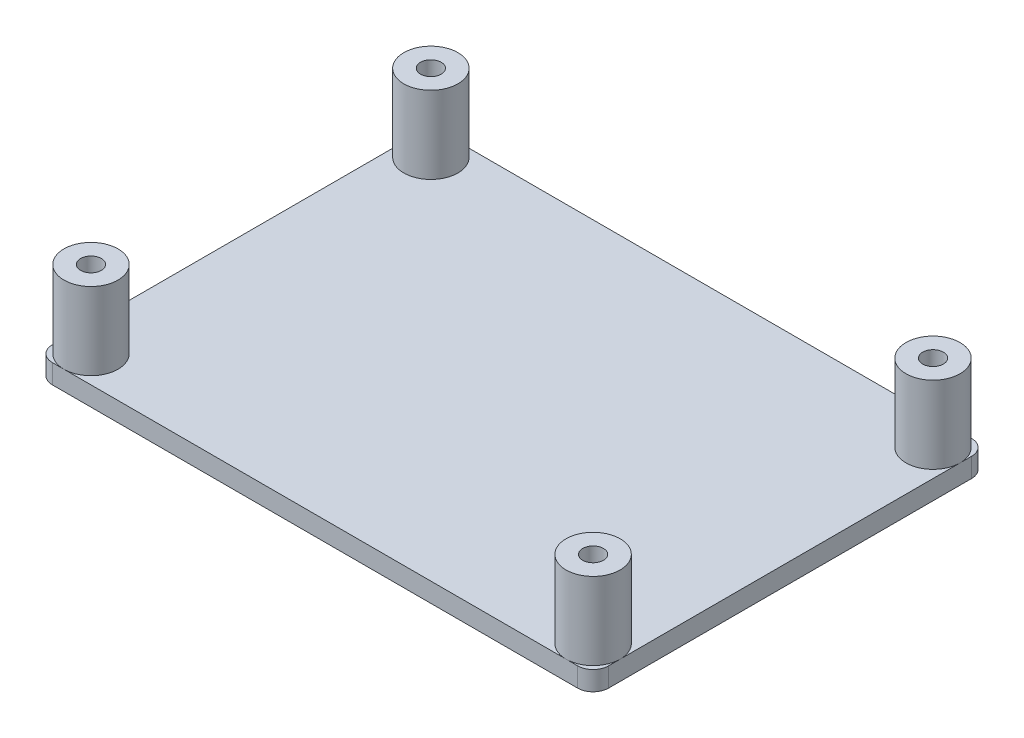
ISO-10303-21;
HEADER;
FILE_DESCRIPTION(('STEP AP214'),'2;1');
FILE_NAME('part.step','',(''),(''),'','','');
FILE_SCHEMA(('AUTOMOTIVE_DESIGN { 1 0 10303 214 1 1 1 1 }'));
ENDSEC;
DATA;
#1=APPLICATION_CONTEXT('core data for automotive mechanical design processes');
#2=APPLICATION_PROTOCOL_DEFINITION('international standard','automotive_design',2000,#1);
#3=PRODUCT_CONTEXT('',#1,'mechanical');
#4=PRODUCT('Part','Part','',(#3));
#5=PRODUCT_RELATED_PRODUCT_CATEGORY('part','',(#4));
#6=PRODUCT_DEFINITION_FORMATION('','',#4);
#7=PRODUCT_DEFINITION_CONTEXT('part definition',#1,'design');
#8=PRODUCT_DEFINITION('design','',#6,#7);
#9=PRODUCT_DEFINITION_SHAPE('','',#8);
#10=(LENGTH_UNIT() NAMED_UNIT(*) SI_UNIT(.MILLI.,.METRE.));
#11=(NAMED_UNIT(*) PLANE_ANGLE_UNIT() SI_UNIT($,.RADIAN.));
#12=(NAMED_UNIT(*) SI_UNIT($,.STERADIAN.) SOLID_ANGLE_UNIT());
#13=UNCERTAINTY_MEASURE_WITH_UNIT(LENGTH_MEASURE(1.E-05),#10,'distance_accuracy_value','');
#14=(GEOMETRIC_REPRESENTATION_CONTEXT(3) GLOBAL_UNCERTAINTY_ASSIGNED_CONTEXT((#13)) GLOBAL_UNIT_ASSIGNED_CONTEXT((#10,
#11,#12)) REPRESENTATION_CONTEXT('',''));
#15=CARTESIAN_POINT('',(0.,0.,0.));
#16=DIRECTION('',(0.,0.,1.));
#17=DIRECTION('',(1.,0.,0.));
#18=AXIS2_PLACEMENT_3D('',#15,#16,#17);
#19=CARTESIAN_POINT('',(0.,3.175,0.));
#20=DIRECTION('',(0.,-1.,0.));
#21=DIRECTION('',(0.,0.,-1.));
#22=AXIS2_PLACEMENT_3D('',#19,#20,#21);
#23=PLANE('',#22);
#24=DIRECTION('',(0.,0.,1.));
#25=VECTOR('',#24,1.);
#26=CARTESIAN_POINT('',(-45.72,3.175,32.385));
#27=LINE('',#26,#25);
#28=CARTESIAN_POINT('',(-45.72,3.175,27.94));
#29=VERTEX_POINT('',#28);
#30=CARTESIAN_POINT('',(-45.72,3.175,29.845));
#31=VERTEX_POINT('',#30);
#32=EDGE_CURVE('E145',#29,#31,#27,.T.);
#33=ORIENTED_EDGE('',*,*,#32,.T.);
#34=CARTESIAN_POINT('',(-43.18,3.175,29.845));
#35=DIRECTION('',(0.,-1.,0.));
#36=DIRECTION('',(0.,0.,-1.));
#37=AXIS2_PLACEMENT_3D('',#34,#35,#36);
#38=CIRCLE('',#37,2.54);
#39=CARTESIAN_POINT('',(-43.18,3.175,32.385));
#40=VERTEX_POINT('',#39);
#41=EDGE_CURVE('E11',#31,#40,#38,.F.);
#42=ORIENTED_EDGE('',*,*,#41,.T.);
#43=DIRECTION('',(1.,0.,0.));
#44=VECTOR('',#43,1.);
#45=CARTESIAN_POINT('',(-45.72,3.175,32.385));
#46=LINE('',#45,#44);
#47=CARTESIAN_POINT('',(-41.275,3.175,32.385));
#48=VERTEX_POINT('',#47);
#49=EDGE_CURVE('E156',#40,#48,#46,.T.);
#50=ORIENTED_EDGE('',*,*,#49,.T.);
#51=CARTESIAN_POINT('',(-41.275,3.175,27.94));
#52=DIRECTION('',(0.,1.,0.));
#53=DIRECTION('',(0.,0.,1.));
#54=AXIS2_PLACEMENT_3D('',#51,#52,#53);
#55=CIRCLE('',#54,4.44499999999998);
#56=EDGE_CURVE('E154',#29,#48,#55,.T.);
#57=ORIENTED_EDGE('',*,*,#56,.F.);
#58=EDGE_LOOP('',(#33,#42,#50,#57));
#59=FACE_BOUND('',#58,.T.);
#60=ADVANCED_FACE('F43',(#59),#23,.F.);
#61=CARTESIAN_POINT('',(41.275,3.175,32.385));
#62=VERTEX_POINT('',#61);
#63=CARTESIAN_POINT('',(43.18,3.175,32.385));
#64=VERTEX_POINT('',#63);
#65=EDGE_CURVE('E206',#62,#64,#46,.T.);
#66=ORIENTED_EDGE('',*,*,#65,.T.);
#67=CARTESIAN_POINT('',(43.18,3.175,29.845));
#68=DIRECTION('',(0.,-1.,0.));
#69=DIRECTION('',(0.,0.,-1.));
#70=AXIS2_PLACEMENT_3D('',#67,#68,#69);
#71=CIRCLE('',#70,2.54);
#72=CARTESIAN_POINT('',(45.72,3.175,29.845));
#73=VERTEX_POINT('',#72);
#74=EDGE_CURVE('E264',#64,#73,#71,.F.);
#75=ORIENTED_EDGE('',*,*,#74,.T.);
#76=DIRECTION('',(0.,0.,-1.));
#77=VECTOR('',#76,1.);
#78=CARTESIAN_POINT('',(45.72,3.175,32.385));
#79=LINE('',#78,#77);
#80=CARTESIAN_POINT('',(45.72,3.175,27.94));
#81=VERTEX_POINT('',#80);
#82=EDGE_CURVE('E196',#73,#81,#79,.T.);
#83=ORIENTED_EDGE('',*,*,#82,.T.);
#84=CARTESIAN_POINT('',(41.275,3.175,27.94));
#85=DIRECTION('',(0.,1.,0.));
#86=DIRECTION('',(0.,0.,1.));
#87=AXIS2_PLACEMENT_3D('',#84,#85,#86);
#88=CIRCLE('',#87,4.44499999999999);
#89=EDGE_CURVE('E176',#62,#81,#88,.T.);
#90=ORIENTED_EDGE('',*,*,#89,.F.);
#91=EDGE_LOOP('',(#66,#75,#83,#90));
#92=FACE_BOUND('',#91,.T.);
#93=ADVANCED_FACE('F329',(#92),#23,.F.);
#94=EDGE_CURVE('E138',#48,#29,#55,.T.);
#95=ORIENTED_EDGE('',*,*,#94,.F.);
#96=EDGE_CURVE('E209',#48,#62,#46,.T.);
#97=ORIENTED_EDGE('',*,*,#96,.T.);
#98=EDGE_CURVE('E166',#81,#62,#88,.T.);
#99=ORIENTED_EDGE('',*,*,#98,.F.);
#100=CARTESIAN_POINT('',(45.72,3.175,-27.94));
#101=VERTEX_POINT('',#100);
#102=EDGE_CURVE('E200',#81,#101,#79,.T.);
#103=ORIENTED_EDGE('',*,*,#102,.T.);
#104=CARTESIAN_POINT('',(41.275,3.175,-27.94));
#105=DIRECTION('',(0.,-1.,0.));
#106=DIRECTION('',(0.,0.,-1.));
#107=AXIS2_PLACEMENT_3D('',#104,#105,#106);
#108=CIRCLE('',#107,4.44499999999998);
#109=CARTESIAN_POINT('',(41.275,3.175,-32.385));
#110=VERTEX_POINT('',#109);
#111=EDGE_CURVE('E224',#110,#101,#108,.F.);
#112=ORIENTED_EDGE('',*,*,#111,.F.);
#113=DIRECTION('',(-1.,0.,0.));
#114=VECTOR('',#113,1.);
#115=CARTESIAN_POINT('',(-45.72,3.175,-32.385));
#116=LINE('',#115,#114);
#117=CARTESIAN_POINT('',(-41.275,3.175,-32.385));
#118=VERTEX_POINT('',#117);
#119=EDGE_CURVE('E203',#110,#118,#116,.T.);
#120=ORIENTED_EDGE('',*,*,#119,.T.);
#121=CARTESIAN_POINT('',(-41.275,3.175,-27.94));
#122=DIRECTION('',(0.,1.,0.));
#123=DIRECTION('',(0.,0.,1.));
#124=AXIS2_PLACEMENT_3D('',#121,#122,#123);
#125=CIRCLE('',#124,4.44499999999998);
#126=CARTESIAN_POINT('',(-45.72,3.175,-27.94));
#127=VERTEX_POINT('',#126);
#128=EDGE_CURVE('E141',#127,#118,#125,.T.);
#129=ORIENTED_EDGE('',*,*,#128,.F.);
#130=EDGE_CURVE('E135',#127,#29,#27,.T.);
#131=ORIENTED_EDGE('',*,*,#130,.T.);
#132=EDGE_LOOP('',(#95,#97,#99,#103,#112,#120,#129,#131));
#133=FACE_BOUND('',#132,.T.);
#134=ADVANCED_FACE('F136',(#133),#23,.F.);
#135=CARTESIAN_POINT('',(-43.18,3.175,-32.385));
#136=VERTEX_POINT('',#135);
#137=EDGE_CURVE('E199',#118,#136,#116,.T.);
#138=ORIENTED_EDGE('',*,*,#137,.T.);
#139=CARTESIAN_POINT('',(-43.18,3.175,-29.845));
#140=DIRECTION('',(0.,-1.,0.));
#141=DIRECTION('',(0.,0.,-1.));
#142=AXIS2_PLACEMENT_3D('',#139,#140,#141);
#143=CIRCLE('',#142,2.54);
#144=CARTESIAN_POINT('',(-45.72,3.175,-29.845));
#145=VERTEX_POINT('',#144);
#146=EDGE_CURVE('E52',#136,#145,#143,.F.);
#147=ORIENTED_EDGE('',*,*,#146,.T.);
#148=EDGE_CURVE('E144',#145,#127,#27,.T.);
#149=ORIENTED_EDGE('',*,*,#148,.T.);
#150=EDGE_CURVE('E185',#118,#127,#125,.T.);
#151=ORIENTED_EDGE('',*,*,#150,.F.);
#152=EDGE_LOOP('',(#138,#147,#149,#151));
#153=FACE_BOUND('',#152,.T.);
#154=ADVANCED_FACE('F309',(#153),#23,.F.);
#155=CARTESIAN_POINT('',(45.72,3.175,32.385));
#156=DIRECTION('',(-1.,0.,0.));
#157=DIRECTION('',(0.,0.,1.));
#158=AXIS2_PLACEMENT_3D('',#155,#156,#157);
#159=PLANE('',#158);
#160=DIRECTION('',(0.,0.,-1.));
#161=VECTOR('',#160,1.);
#162=CARTESIAN_POINT('',(45.72,0.,32.385));
#163=LINE('',#162,#161);
#164=CARTESIAN_POINT('',(45.72,0.,29.845));
#165=VERTEX_POINT('',#164);
#166=CARTESIAN_POINT('',(45.72,0.,-29.845));
#167=VERTEX_POINT('',#166);
#168=EDGE_CURVE('E193',#165,#167,#163,.T.);
#169=ORIENTED_EDGE('',*,*,#168,.T.);
#170=DIRECTION('',(0.,-1.,0.));
#171=VECTOR('',#170,1.);
#172=CARTESIAN_POINT('',(45.72,3.175,-29.845));
#173=LINE('',#172,#171);
#174=CARTESIAN_POINT('',(45.72,3.175,-29.845));
#175=VERTEX_POINT('',#174);
#176=EDGE_CURVE('E251',#167,#175,#173,.F.);
#177=ORIENTED_EDGE('',*,*,#176,.T.);
#178=EDGE_CURVE('E201',#101,#175,#79,.T.);
#179=ORIENTED_EDGE('',*,*,#178,.F.);
#180=ORIENTED_EDGE('',*,*,#102,.F.);
#181=ORIENTED_EDGE('',*,*,#82,.F.);
#182=DIRECTION('',(0.,-1.,0.));
#183=VECTOR('',#182,1.);
#184=CARTESIAN_POINT('',(45.72,3.175,29.845));
#185=LINE('',#184,#183);
#186=EDGE_CURVE('E247',#73,#165,#185,.T.);
#187=ORIENTED_EDGE('',*,*,#186,.T.);
#188=EDGE_LOOP('',(#169,#177,#179,#180,#181,#187));
#189=FACE_BOUND('',#188,.T.);
#190=ADVANCED_FACE('F295',(#189),#159,.F.);
#191=CARTESIAN_POINT('',(-45.72,3.175,-32.385));
#192=DIRECTION('',(0.,0.,1.));
#193=DIRECTION('',(1.,0.,0.));
#194=AXIS2_PLACEMENT_3D('',#191,#192,#193);
#195=PLANE('',#194);
#196=CARTESIAN_POINT('',(43.18,3.175,-32.385));
#197=VERTEX_POINT('',#196);
#198=EDGE_CURVE('E152',#197,#110,#116,.T.);
#199=ORIENTED_EDGE('',*,*,#198,.F.);
#200=DIRECTION('',(0.,-1.,0.));
#201=VECTOR('',#200,1.);
#202=CARTESIAN_POINT('',(43.18,3.175,-32.385));
#203=LINE('',#202,#201);
#204=CARTESIAN_POINT('',(43.18,0.,-32.385));
#205=VERTEX_POINT('',#204);
#206=EDGE_CURVE('E231',#197,#205,#203,.T.);
#207=ORIENTED_EDGE('',*,*,#206,.T.);
#208=DIRECTION('',(-1.,0.,0.));
#209=VECTOR('',#208,1.);
#210=CARTESIAN_POINT('',(-45.72,0.,-32.385));
#211=LINE('',#210,#209);
#212=CARTESIAN_POINT('',(-43.18,0.,-32.385));
#213=VERTEX_POINT('',#212);
#214=EDGE_CURVE('E213',#205,#213,#211,.T.);
#215=ORIENTED_EDGE('',*,*,#214,.T.);
#216=DIRECTION('',(0.,-1.,0.));
#217=VECTOR('',#216,1.);
#218=CARTESIAN_POINT('',(-43.18,3.175,-32.385));
#219=LINE('',#218,#217);
#220=EDGE_CURVE('E228',#213,#136,#219,.F.);
#221=ORIENTED_EDGE('',*,*,#220,.T.);
#222=ORIENTED_EDGE('',*,*,#137,.F.);
#223=ORIENTED_EDGE('',*,*,#119,.F.);
#224=EDGE_LOOP('',(#199,#207,#215,#221,#222,#223));
#225=FACE_BOUND('',#224,.T.);
#226=ADVANCED_FACE('F307',(#225),#195,.F.);
#227=CARTESIAN_POINT('',(-45.72,3.175,32.385));
#228=DIRECTION('',(1.,0.,0.));
#229=DIRECTION('',(0.,0.,-1.));
#230=AXIS2_PLACEMENT_3D('',#227,#228,#229);
#231=PLANE('',#230);
#232=ORIENTED_EDGE('',*,*,#148,.F.);
#233=DIRECTION('',(0.,-1.,0.));
#234=VECTOR('',#233,1.);
#235=CARTESIAN_POINT('',(-45.72,3.175,-29.845));
#236=LINE('',#235,#234);
#237=CARTESIAN_POINT('',(-45.72,0.,-29.845));
#238=VERTEX_POINT('',#237);
#239=EDGE_CURVE('E269',#145,#238,#236,.T.);
#240=ORIENTED_EDGE('',*,*,#239,.T.);
#241=DIRECTION('',(0.,0.,1.));
#242=VECTOR('',#241,1.);
#243=CARTESIAN_POINT('',(-45.72,0.,32.385));
#244=LINE('',#243,#242);
#245=CARTESIAN_POINT('',(-45.72,0.,29.845));
#246=VERTEX_POINT('',#245);
#247=EDGE_CURVE('E217',#238,#246,#244,.T.);
#248=ORIENTED_EDGE('',*,*,#247,.T.);
#249=DIRECTION('',(0.,-1.,0.));
#250=VECTOR('',#249,1.);
#251=CARTESIAN_POINT('',(-45.72,3.175,29.845));
#252=LINE('',#251,#250);
#253=EDGE_CURVE('E66',#246,#31,#252,.F.);
#254=ORIENTED_EDGE('',*,*,#253,.T.);
#255=ORIENTED_EDGE('',*,*,#32,.F.);
#256=ORIENTED_EDGE('',*,*,#130,.F.);
#257=EDGE_LOOP('',(#232,#240,#248,#254,#255,#256));
#258=FACE_BOUND('',#257,.T.);
#259=ADVANCED_FACE('F148',(#258),#231,.F.);
#260=CARTESIAN_POINT('',(-45.72,3.175,32.385));
#261=DIRECTION('',(0.,0.,-1.));
#262=DIRECTION('',(-1.,0.,0.));
#263=AXIS2_PLACEMENT_3D('',#260,#261,#262);
#264=PLANE('',#263);
#265=DIRECTION('',(1.,0.,0.));
#266=VECTOR('',#265,1.);
#267=CARTESIAN_POINT('',(-45.72,0.,32.385));
#268=LINE('',#267,#266);
#269=CARTESIAN_POINT('',(-43.18,0.,32.385));
#270=VERTEX_POINT('',#269);
#271=CARTESIAN_POINT('',(43.18,0.,32.385));
#272=VERTEX_POINT('',#271);
#273=EDGE_CURVE('E220',#270,#272,#268,.T.);
#274=ORIENTED_EDGE('',*,*,#273,.T.);
#275=DIRECTION('',(0.,-1.,0.));
#276=VECTOR('',#275,1.);
#277=CARTESIAN_POINT('',(43.18,3.175,32.385));
#278=LINE('',#277,#276);
#279=EDGE_CURVE('E261',#272,#64,#278,.F.);
#280=ORIENTED_EDGE('',*,*,#279,.T.);
#281=ORIENTED_EDGE('',*,*,#65,.F.);
#282=ORIENTED_EDGE('',*,*,#96,.F.);
#283=ORIENTED_EDGE('',*,*,#49,.F.);
#284=DIRECTION('',(0.,-1.,0.));
#285=VECTOR('',#284,1.);
#286=CARTESIAN_POINT('',(-43.18,3.175,32.385));
#287=LINE('',#286,#285);
#288=EDGE_CURVE('E257',#40,#270,#287,.T.);
#289=ORIENTED_EDGE('',*,*,#288,.T.);
#290=EDGE_LOOP('',(#274,#280,#281,#282,#283,#289));
#291=FACE_BOUND('',#290,.T.);
#292=ADVANCED_FACE('F335',(#291),#264,.F.);
#293=ORIENTED_EDGE('',*,*,#178,.T.);
#294=CARTESIAN_POINT('',(43.18,3.175,-29.845));
#295=DIRECTION('',(0.,-1.,0.));
#296=DIRECTION('',(0.,0.,-1.));
#297=AXIS2_PLACEMENT_3D('',#294,#295,#296);
#298=CIRCLE('',#297,2.54);
#299=EDGE_CURVE('E254',#175,#197,#298,.F.);
#300=ORIENTED_EDGE('',*,*,#299,.T.);
#301=ORIENTED_EDGE('',*,*,#198,.T.);
#302=CARTESIAN_POINT('',(41.275,3.175,-27.94));
#303=DIRECTION('',(0.,1.,0.));
#304=DIRECTION('',(0.,0.,1.));
#305=AXIS2_PLACEMENT_3D('',#302,#303,#304);
#306=CIRCLE('',#305,4.44499999999998);
#307=EDGE_CURVE('E181',#101,#110,#306,.T.);
#308=ORIENTED_EDGE('',*,*,#307,.F.);
#309=EDGE_LOOP('',(#293,#300,#301,#308));
#310=FACE_BOUND('',#309,.T.);
#311=ADVANCED_FACE('F323',(#310),#23,.F.);
#312=CARTESIAN_POINT('',(0.,0.,0.));
#313=DIRECTION('',(0.,-1.,0.));
#314=DIRECTION('',(0.,0.,-1.));
#315=AXIS2_PLACEMENT_3D('',#312,#313,#314);
#316=PLANE('',#315);
#317=CARTESIAN_POINT('',(-41.275,0.,27.94));
#318=DIRECTION('',(0.,1.,0.));
#319=DIRECTION('',(0.,0.,1.));
#320=AXIS2_PLACEMENT_3D('',#317,#318,#319);
#321=CIRCLE('',#320,1.6999966);
#322=CARTESIAN_POINT('',(-41.275,0.,29.6399966));
#323=VERTEX_POINT('',#322);
#324=EDGE_CURVE('E622',#323,#323,#321,.T.);
#325=ORIENTED_EDGE('',*,*,#324,.T.);
#326=EDGE_LOOP('',(#325));
#327=FACE_BOUND('',#326,.T.);
#328=CARTESIAN_POINT('',(41.275,0.,27.94));
#329=DIRECTION('',(0.,1.,0.));
#330=DIRECTION('',(0.,0.,1.));
#331=AXIS2_PLACEMENT_3D('',#328,#329,#330);
#332=CIRCLE('',#331,1.6999966);
#333=CARTESIAN_POINT('',(41.275,0.,29.6399966));
#334=VERTEX_POINT('',#333);
#335=EDGE_CURVE('E614',#334,#334,#332,.T.);
#336=ORIENTED_EDGE('',*,*,#335,.T.);
#337=EDGE_LOOP('',(#336));
#338=FACE_BOUND('',#337,.T.);
#339=CARTESIAN_POINT('',(41.275,0.,-27.94));
#340=DIRECTION('',(0.,1.,0.));
#341=DIRECTION('',(0.,0.,1.));
#342=AXIS2_PLACEMENT_3D('',#339,#340,#341);
#343=CIRCLE('',#342,1.6999966);
#344=CARTESIAN_POINT('',(41.275,0.,-26.2400034));
#345=VERTEX_POINT('',#344);
#346=EDGE_CURVE('E602',#345,#345,#343,.T.);
#347=ORIENTED_EDGE('',*,*,#346,.T.);
#348=EDGE_LOOP('',(#347));
#349=FACE_BOUND('',#348,.T.);
#350=CARTESIAN_POINT('',(-41.275,0.,-27.94));
#351=DIRECTION('',(0.,1.,0.));
#352=DIRECTION('',(0.,0.,1.));
#353=AXIS2_PLACEMENT_3D('',#350,#351,#352);
#354=CIRCLE('',#353,1.6999966);
#355=CARTESIAN_POINT('',(-41.275,0.,-26.2400034));
#356=VERTEX_POINT('',#355);
#357=EDGE_CURVE('E175',#356,#356,#354,.T.);
#358=ORIENTED_EDGE('',*,*,#357,.T.);
#359=EDGE_LOOP('',(#358));
#360=FACE_BOUND('',#359,.T.);
#361=ORIENTED_EDGE('',*,*,#214,.F.);
#362=CARTESIAN_POINT('',(43.18,0.,-29.845));
#363=DIRECTION('',(0.,-1.,0.));
#364=DIRECTION('',(0.,0.,-1.));
#365=AXIS2_PLACEMENT_3D('',#362,#363,#364);
#366=CIRCLE('',#365,2.54);
#367=EDGE_CURVE('E244',#205,#167,#366,.T.);
#368=ORIENTED_EDGE('',*,*,#367,.T.);
#369=ORIENTED_EDGE('',*,*,#168,.F.);
#370=CARTESIAN_POINT('',(43.18,0.,29.845));
#371=DIRECTION('',(0.,-1.,0.));
#372=DIRECTION('',(0.,0.,-1.));
#373=AXIS2_PLACEMENT_3D('',#370,#371,#372);
#374=CIRCLE('',#373,2.54);
#375=EDGE_CURVE('E241',#165,#272,#374,.T.);
#376=ORIENTED_EDGE('',*,*,#375,.T.);
#377=ORIENTED_EDGE('',*,*,#273,.F.);
#378=CARTESIAN_POINT('',(-43.18,0.,29.845));
#379=DIRECTION('',(0.,-1.,0.));
#380=DIRECTION('',(0.,0.,-1.));
#381=AXIS2_PLACEMENT_3D('',#378,#379,#380);
#382=CIRCLE('',#381,2.54);
#383=EDGE_CURVE('E235',#270,#246,#382,.T.);
#384=ORIENTED_EDGE('',*,*,#383,.T.);
#385=ORIENTED_EDGE('',*,*,#247,.F.);
#386=CARTESIAN_POINT('',(-43.18,0.,-29.845));
#387=DIRECTION('',(0.,-1.,0.));
#388=DIRECTION('',(0.,0.,-1.));
#389=AXIS2_PLACEMENT_3D('',#386,#387,#388);
#390=CIRCLE('',#389,2.54);
#391=EDGE_CURVE('E238',#238,#213,#390,.T.);
#392=ORIENTED_EDGE('',*,*,#391,.T.);
#393=EDGE_LOOP('',(#361,#368,#369,#376,#377,#384,#385,#392));
#394=FACE_BOUND('',#393,.T.);
#395=ADVANCED_FACE('F314',(#327,#338,#349,#360,#394),#316,.T.);
#396=CARTESIAN_POINT('',(-41.275,15.875,-27.94));
#397=DIRECTION('',(0.,-1.,0.));
#398=DIRECTION('',(0.,0.,-1.));
#399=AXIS2_PLACEMENT_3D('',#396,#397,#398);
#400=CYLINDRICAL_SURFACE('',#399,4.44499999999998);
#401=CARTESIAN_POINT('',(-41.275,15.875,-27.94));
#402=DIRECTION('',(0.,1.,0.));
#403=DIRECTION('',(0.,0.,1.));
#404=AXIS2_PLACEMENT_3D('',#401,#402,#403);
#405=CIRCLE('',#404,4.44499999999998);
#406=CARTESIAN_POINT('',(-41.275,15.875,-23.495));
#407=VERTEX_POINT('',#406);
#408=EDGE_CURVE('E189',#407,#407,#405,.T.);
#409=ORIENTED_EDGE('',*,*,#408,.F.);
#410=EDGE_LOOP('',(#409));
#411=FACE_BOUND('',#410,.T.);
#412=ORIENTED_EDGE('',*,*,#150,.T.);
#413=ORIENTED_EDGE('',*,*,#128,.T.);
#414=EDGE_LOOP('',(#412,#413));
#415=FACE_BOUND('',#414,.T.);
#416=ADVANCED_FACE('F311',(#411,#415),#400,.T.);
#417=CARTESIAN_POINT('',(-41.275,15.875,-27.94));
#418=DIRECTION('',(0.,1.,0.));
#419=DIRECTION('',(0.,0.,1.));
#420=AXIS2_PLACEMENT_3D('',#417,#418,#419);
#421=PLANE('',#420);
#422=CARTESIAN_POINT('',(-41.275,15.875,-27.94));
#423=DIRECTION('',(0.,1.,0.));
#424=DIRECTION('',(0.,0.,1.));
#425=AXIS2_PLACEMENT_3D('',#422,#423,#424);
#426=CIRCLE('',#425,1.6999966);
#427=CARTESIAN_POINT('',(-41.275,15.875,-26.2400034));
#428=VERTEX_POINT('',#427);
#429=EDGE_CURVE('E170',#428,#428,#426,.T.);
#430=ORIENTED_EDGE('',*,*,#429,.F.);
#431=EDGE_LOOP('',(#430));
#432=FACE_BOUND('',#431,.T.);
#433=ORIENTED_EDGE('',*,*,#408,.T.);
#434=EDGE_LOOP('',(#433));
#435=FACE_BOUND('',#434,.T.);
#436=ADVANCED_FACE('F313',(#432,#435),#421,.T.);
#437=CARTESIAN_POINT('',(41.275,15.875,-27.94));
#438=DIRECTION('',(0.,-1.,0.));
#439=DIRECTION('',(0.,0.,-1.));
#440=AXIS2_PLACEMENT_3D('',#437,#438,#439);
#441=CYLINDRICAL_SURFACE('',#440,4.44499999999998);
#442=CARTESIAN_POINT('',(41.275,15.875,-27.94));
#443=DIRECTION('',(0.,1.,0.));
#444=DIRECTION('',(0.,0.,1.));
#445=AXIS2_PLACEMENT_3D('',#442,#443,#444);
#446=CIRCLE('',#445,4.44499999999998);
#447=CARTESIAN_POINT('',(41.275,15.875,-23.495));
#448=VERTEX_POINT('',#447);
#449=EDGE_CURVE('E179',#448,#448,#446,.T.);
#450=ORIENTED_EDGE('',*,*,#449,.F.);
#451=EDGE_LOOP('',(#450));
#452=FACE_BOUND('',#451,.T.);
#453=ORIENTED_EDGE('',*,*,#307,.T.);
#454=ORIENTED_EDGE('',*,*,#111,.T.);
#455=EDGE_LOOP('',(#453,#454));
#456=FACE_BOUND('',#455,.T.);
#457=ADVANCED_FACE('F301',(#452,#456),#441,.T.);
#458=CARTESIAN_POINT('',(41.275,15.875,-27.94));
#459=DIRECTION('',(0.,1.,0.));
#460=DIRECTION('',(0.,0.,1.));
#461=AXIS2_PLACEMENT_3D('',#458,#459,#460);
#462=PLANE('',#461);
#463=CARTESIAN_POINT('',(41.275,15.875,-27.94));
#464=DIRECTION('',(0.,1.,0.));
#465=DIRECTION('',(0.,0.,1.));
#466=AXIS2_PLACEMENT_3D('',#463,#464,#465);
#467=CIRCLE('',#466,1.6999966);
#468=CARTESIAN_POINT('',(41.275,15.875,-26.2400034));
#469=VERTEX_POINT('',#468);
#470=EDGE_CURVE('E599',#469,#469,#467,.T.);
#471=ORIENTED_EDGE('',*,*,#470,.F.);
#472=EDGE_LOOP('',(#471));
#473=FACE_BOUND('',#472,.T.);
#474=ORIENTED_EDGE('',*,*,#449,.T.);
#475=EDGE_LOOP('',(#474));
#476=FACE_BOUND('',#475,.T.);
#477=ADVANCED_FACE('F528',(#473,#476),#462,.T.);
#478=CARTESIAN_POINT('',(41.275,15.875,27.94));
#479=DIRECTION('',(0.,-1.,0.));
#480=DIRECTION('',(0.,0.,-1.));
#481=AXIS2_PLACEMENT_3D('',#478,#479,#480);
#482=CYLINDRICAL_SURFACE('',#481,4.44499999999999);
#483=CARTESIAN_POINT('',(41.275,15.875,27.94));
#484=DIRECTION('',(0.,1.,0.));
#485=DIRECTION('',(0.,0.,1.));
#486=AXIS2_PLACEMENT_3D('',#483,#484,#485);
#487=CIRCLE('',#486,4.44499999999999);
#488=CARTESIAN_POINT('',(41.275,15.875,32.385));
#489=VERTEX_POINT('',#488);
#490=EDGE_CURVE('E163',#489,#489,#487,.T.);
#491=ORIENTED_EDGE('',*,*,#490,.F.);
#492=EDGE_LOOP('',(#491));
#493=FACE_BOUND('',#492,.T.);
#494=ORIENTED_EDGE('',*,*,#89,.T.);
#495=ORIENTED_EDGE('',*,*,#98,.T.);
#496=EDGE_LOOP('',(#494,#495));
#497=FACE_BOUND('',#496,.T.);
#498=ADVANCED_FACE('F286',(#493,#497),#482,.T.);
#499=CARTESIAN_POINT('',(41.275,15.875,27.94));
#500=DIRECTION('',(0.,1.,0.));
#501=DIRECTION('',(0.,0.,1.));
#502=AXIS2_PLACEMENT_3D('',#499,#500,#501);
#503=PLANE('',#502);
#504=CARTESIAN_POINT('',(41.275,15.875,27.94));
#505=DIRECTION('',(0.,1.,0.));
#506=DIRECTION('',(0.,0.,1.));
#507=AXIS2_PLACEMENT_3D('',#504,#505,#506);
#508=CIRCLE('',#507,1.6999966);
#509=CARTESIAN_POINT('',(41.275,15.875,29.6399966));
#510=VERTEX_POINT('',#509);
#511=EDGE_CURVE('E608',#510,#510,#508,.T.);
#512=ORIENTED_EDGE('',*,*,#511,.F.);
#513=EDGE_LOOP('',(#512));
#514=FACE_BOUND('',#513,.T.);
#515=ORIENTED_EDGE('',*,*,#490,.T.);
#516=EDGE_LOOP('',(#515));
#517=FACE_BOUND('',#516,.T.);
#518=ADVANCED_FACE('F509',(#514,#517),#503,.T.);
#519=CARTESIAN_POINT('',(-41.275,15.875,27.94));
#520=DIRECTION('',(0.,-1.,0.));
#521=DIRECTION('',(0.,0.,-1.));
#522=AXIS2_PLACEMENT_3D('',#519,#520,#521);
#523=CYLINDRICAL_SURFACE('',#522,4.44499999999998);
#524=CARTESIAN_POINT('',(-41.275,15.875,27.94));
#525=DIRECTION('',(0.,1.,0.));
#526=DIRECTION('',(0.,0.,1.));
#527=AXIS2_PLACEMENT_3D('',#524,#525,#526);
#528=CIRCLE('',#527,4.44499999999998);
#529=CARTESIAN_POINT('',(-41.275,15.875,32.385));
#530=VERTEX_POINT('',#529);
#531=EDGE_CURVE('E159',#530,#530,#528,.T.);
#532=ORIENTED_EDGE('',*,*,#531,.F.);
#533=EDGE_LOOP('',(#532));
#534=FACE_BOUND('',#533,.T.);
#535=ORIENTED_EDGE('',*,*,#94,.T.);
#536=ORIENTED_EDGE('',*,*,#56,.T.);
#537=EDGE_LOOP('',(#535,#536));
#538=FACE_BOUND('',#537,.T.);
#539=ADVANCED_FACE('F161',(#534,#538),#523,.T.);
#540=CARTESIAN_POINT('',(-41.275,15.875,27.94));
#541=DIRECTION('',(0.,1.,0.));
#542=DIRECTION('',(0.,0.,1.));
#543=AXIS2_PLACEMENT_3D('',#540,#541,#542);
#544=PLANE('',#543);
#545=CARTESIAN_POINT('',(-41.275,15.875,27.94));
#546=DIRECTION('',(0.,1.,0.));
#547=DIRECTION('',(0.,0.,1.));
#548=AXIS2_PLACEMENT_3D('',#545,#546,#547);
#549=CIRCLE('',#548,1.6999966);
#550=CARTESIAN_POINT('',(-41.275,15.875,29.6399966));
#551=VERTEX_POINT('',#550);
#552=EDGE_CURVE('E618',#551,#551,#549,.T.);
#553=ORIENTED_EDGE('',*,*,#552,.F.);
#554=EDGE_LOOP('',(#553));
#555=FACE_BOUND('',#554,.T.);
#556=ORIENTED_EDGE('',*,*,#531,.T.);
#557=EDGE_LOOP('',(#556));
#558=FACE_BOUND('',#557,.T.);
#559=ADVANCED_FACE('F490',(#555,#558),#544,.T.);
#560=CARTESIAN_POINT('',(-41.275,0.,27.94));
#561=DIRECTION('',(0.,1.,0.));
#562=DIRECTION('',(0.,0.,1.));
#563=AXIS2_PLACEMENT_3D('',#560,#561,#562);
#564=CYLINDRICAL_SURFACE('',#563,1.6999966);
#565=ORIENTED_EDGE('',*,*,#324,.F.);
#566=EDGE_LOOP('',(#565));
#567=FACE_BOUND('',#566,.T.);
#568=ORIENTED_EDGE('',*,*,#552,.T.);
#569=EDGE_LOOP('',(#568));
#570=FACE_BOUND('',#569,.T.);
#571=ADVANCED_FACE('F480',(#567,#570),#564,.F.);
#572=CARTESIAN_POINT('',(41.275,0.,27.94));
#573=DIRECTION('',(0.,1.,0.));
#574=DIRECTION('',(0.,0.,1.));
#575=AXIS2_PLACEMENT_3D('',#572,#573,#574);
#576=CYLINDRICAL_SURFACE('',#575,1.6999966);
#577=ORIENTED_EDGE('',*,*,#335,.F.);
#578=EDGE_LOOP('',(#577));
#579=FACE_BOUND('',#578,.T.);
#580=ORIENTED_EDGE('',*,*,#511,.T.);
#581=EDGE_LOOP('',(#580));
#582=FACE_BOUND('',#581,.T.);
#583=ADVANCED_FACE('F470',(#579,#582),#576,.F.);
#584=CARTESIAN_POINT('',(41.275,0.,-27.94));
#585=DIRECTION('',(0.,1.,0.));
#586=DIRECTION('',(0.,0.,1.));
#587=AXIS2_PLACEMENT_3D('',#584,#585,#586);
#588=CYLINDRICAL_SURFACE('',#587,1.6999966);
#589=ORIENTED_EDGE('',*,*,#346,.F.);
#590=EDGE_LOOP('',(#589));
#591=FACE_BOUND('',#590,.T.);
#592=ORIENTED_EDGE('',*,*,#470,.T.);
#593=EDGE_LOOP('',(#592));
#594=FACE_BOUND('',#593,.T.);
#595=ADVANCED_FACE('F461',(#591,#594),#588,.F.);
#596=CARTESIAN_POINT('',(-41.275,0.,-27.94));
#597=DIRECTION('',(0.,1.,0.));
#598=DIRECTION('',(0.,0.,1.));
#599=AXIS2_PLACEMENT_3D('',#596,#597,#598);
#600=CYLINDRICAL_SURFACE('',#599,1.6999966);
#601=ORIENTED_EDGE('',*,*,#357,.F.);
#602=EDGE_LOOP('',(#601));
#603=FACE_BOUND('',#602,.T.);
#604=ORIENTED_EDGE('',*,*,#429,.T.);
#605=EDGE_LOOP('',(#604));
#606=FACE_BOUND('',#605,.T.);
#607=ADVANCED_FACE('F417',(#603,#606),#600,.F.);
#608=CARTESIAN_POINT('',(43.18,3.175,-29.845));
#609=DIRECTION('',(0.,-1.,0.));
#610=DIRECTION('',(0.,0.,-1.));
#611=AXIS2_PLACEMENT_3D('',#608,#609,#610);
#612=CYLINDRICAL_SURFACE('',#611,2.54);
#613=ORIENTED_EDGE('',*,*,#299,.F.);
#614=ORIENTED_EDGE('',*,*,#176,.F.);
#615=ORIENTED_EDGE('',*,*,#367,.F.);
#616=ORIENTED_EDGE('',*,*,#206,.F.);
#617=EDGE_LOOP('',(#613,#614,#615,#616));
#618=FACE_BOUND('',#617,.T.);
#619=ADVANCED_FACE('F411',(#618),#612,.T.);
#620=CARTESIAN_POINT('',(43.18,3.175,29.845));
#621=DIRECTION('',(0.,-1.,0.));
#622=DIRECTION('',(0.,0.,-1.));
#623=AXIS2_PLACEMENT_3D('',#620,#621,#622);
#624=CYLINDRICAL_SURFACE('',#623,2.54);
#625=ORIENTED_EDGE('',*,*,#74,.F.);
#626=ORIENTED_EDGE('',*,*,#279,.F.);
#627=ORIENTED_EDGE('',*,*,#375,.F.);
#628=ORIENTED_EDGE('',*,*,#186,.F.);
#629=EDGE_LOOP('',(#625,#626,#627,#628));
#630=FACE_BOUND('',#629,.T.);
#631=ADVANCED_FACE('F416',(#630),#624,.T.);
#632=CARTESIAN_POINT('',(-43.18,3.175,-29.845));
#633=DIRECTION('',(0.,-1.,0.));
#634=DIRECTION('',(0.,0.,-1.));
#635=AXIS2_PLACEMENT_3D('',#632,#633,#634);
#636=CYLINDRICAL_SURFACE('',#635,2.54);
#637=ORIENTED_EDGE('',*,*,#146,.F.);
#638=ORIENTED_EDGE('',*,*,#220,.F.);
#639=ORIENTED_EDGE('',*,*,#391,.F.);
#640=ORIENTED_EDGE('',*,*,#239,.F.);
#641=EDGE_LOOP('',(#637,#638,#639,#640));
#642=FACE_BOUND('',#641,.T.);
#643=ADVANCED_FACE('F430',(#642),#636,.T.);
#644=CARTESIAN_POINT('',(-43.18,3.175,29.845));
#645=DIRECTION('',(0.,-1.,0.));
#646=DIRECTION('',(0.,0.,-1.));
#647=AXIS2_PLACEMENT_3D('',#644,#645,#646);
#648=CYLINDRICAL_SURFACE('',#647,2.54);
#649=ORIENTED_EDGE('',*,*,#41,.F.);
#650=ORIENTED_EDGE('',*,*,#253,.F.);
#651=ORIENTED_EDGE('',*,*,#383,.F.);
#652=ORIENTED_EDGE('',*,*,#288,.F.);
#653=EDGE_LOOP('',(#649,#650,#651,#652));
#654=FACE_BOUND('',#653,.T.);
#655=ADVANCED_FACE('F45',(#654),#648,.T.);
#656=CLOSED_SHELL('',(#60,#93,#134,#154,#190,#226,#259,#292,#311,#395,#416,#436,#457,#477,#498,
#518,#539,#559,#571,#583,#595,#607,#619,#631,#643,#655));
#657=MANIFOLD_SOLID_BREP('B2',#656);
#658=ADVANCED_BREP_SHAPE_REPRESENTATION('',(#18,#657),#14);
#659=SHAPE_DEFINITION_REPRESENTATION(#9,#658);
ENDSEC;
END-ISO-10303-21;
